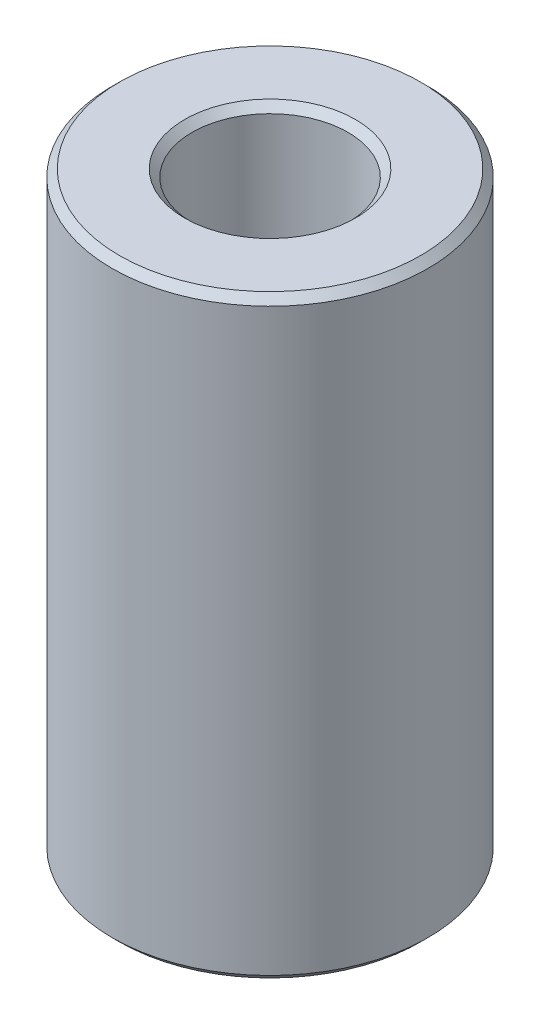
ISO-10303-21;
HEADER;
FILE_DESCRIPTION(('STEP AP214'),'2;1');
FILE_NAME('part.step','',(''),(''),'','','');
FILE_SCHEMA(('AUTOMOTIVE_DESIGN { 1 0 10303 214 1 1 1 1 }'));
ENDSEC;
DATA;
#1=APPLICATION_CONTEXT('core data for automotive mechanical design processes');
#2=APPLICATION_PROTOCOL_DEFINITION('international standard','automotive_design',2000,#1);
#3=PRODUCT_CONTEXT('',#1,'mechanical');
#4=PRODUCT('Part','Part','',(#3));
#5=PRODUCT_RELATED_PRODUCT_CATEGORY('part','',(#4));
#6=PRODUCT_DEFINITION_FORMATION('','',#4);
#7=PRODUCT_DEFINITION_CONTEXT('part definition',#1,'design');
#8=PRODUCT_DEFINITION('design','',#6,#7);
#9=PRODUCT_DEFINITION_SHAPE('','',#8);
#10=(LENGTH_UNIT() NAMED_UNIT(*) SI_UNIT(.MILLI.,.METRE.));
#11=(NAMED_UNIT(*) PLANE_ANGLE_UNIT() SI_UNIT($,.RADIAN.));
#12=(NAMED_UNIT(*) SI_UNIT($,.STERADIAN.) SOLID_ANGLE_UNIT());
#13=UNCERTAINTY_MEASURE_WITH_UNIT(LENGTH_MEASURE(1.E-05),#10,'distance_accuracy_value','');
#14=(GEOMETRIC_REPRESENTATION_CONTEXT(3) GLOBAL_UNCERTAINTY_ASSIGNED_CONTEXT((#13)) GLOBAL_UNIT_ASSIGNED_CONTEXT((#10,
#11,#12)) REPRESENTATION_CONTEXT('',''));
#15=CARTESIAN_POINT('',(0.,0.,0.));
#16=DIRECTION('',(0.,0.,1.));
#17=DIRECTION('',(1.,0.,0.));
#18=AXIS2_PLACEMENT_3D('',#15,#16,#17);
#19=CARTESIAN_POINT('',(0.,16.,0.));
#20=DIRECTION('',(0.,1.,0.));
#21=DIRECTION('',(0.,0.,1.));
#22=AXIS2_PLACEMENT_3D('',#19,#20,#21);
#23=PLANE('',#22);
#24=CARTESIAN_POINT('',(0.,16.,0.));
#25=DIRECTION('',(0.,1.,0.));
#26=DIRECTION('',(0.,0.,1.));
#27=AXIS2_PLACEMENT_3D('',#24,#25,#26);
#28=CIRCLE('',#27,2.3);
#29=CARTESIAN_POINT('',(0.,16.,2.3));
#30=VERTEX_POINT('',#29);
#31=EDGE_CURVE('E57',#30,#30,#28,.F.);
#32=ORIENTED_EDGE('',*,*,#31,.T.);
#33=EDGE_LOOP('',(#32));
#34=FACE_BOUND('',#33,.T.);
#35=CARTESIAN_POINT('',(0.,16.,0.));
#36=DIRECTION('',(0.,1.,0.));
#37=DIRECTION('',(0.,0.,1.));
#38=AXIS2_PLACEMENT_3D('',#35,#36,#37);
#39=CIRCLE('',#38,4.05);
#40=CARTESIAN_POINT('',(0.,16.,4.05));
#41=VERTEX_POINT('',#40);
#42=EDGE_CURVE('E60',#41,#41,#39,.T.);
#43=ORIENTED_EDGE('',*,*,#42,.T.);
#44=EDGE_LOOP('',(#43));
#45=FACE_BOUND('',#44,.T.);
#46=ADVANCED_FACE('F36',(#34,#45),#23,.T.);
#47=CARTESIAN_POINT('',(0.,0.,0.));
#48=DIRECTION('',(0.,1.,0.));
#49=DIRECTION('',(0.,0.,1.));
#50=AXIS2_PLACEMENT_3D('',#47,#48,#49);
#51=PLANE('',#50);
#52=CARTESIAN_POINT('',(0.,0.,0.));
#53=DIRECTION('',(0.,1.,0.));
#54=DIRECTION('',(0.,0.,1.));
#55=AXIS2_PLACEMENT_3D('',#52,#53,#54);
#56=CIRCLE('',#55,2.3);
#57=CARTESIAN_POINT('',(0.,0.,2.3));
#58=VERTEX_POINT('',#57);
#59=EDGE_CURVE('E10',#58,#58,#56,.T.);
#60=ORIENTED_EDGE('',*,*,#59,.T.);
#61=EDGE_LOOP('',(#60));
#62=FACE_BOUND('',#61,.T.);
#63=CARTESIAN_POINT('',(0.,0.,0.));
#64=DIRECTION('',(0.,1.,0.));
#65=DIRECTION('',(0.,0.,1.));
#66=AXIS2_PLACEMENT_3D('',#63,#64,#65);
#67=CIRCLE('',#66,4.05);
#68=CARTESIAN_POINT('',(0.,0.,4.05));
#69=VERTEX_POINT('',#68);
#70=EDGE_CURVE('E44',#69,#69,#67,.F.);
#71=ORIENTED_EDGE('',*,*,#70,.T.);
#72=EDGE_LOOP('',(#71));
#73=FACE_BOUND('',#72,.T.);
#74=ADVANCED_FACE('F86',(#62,#73),#51,.F.);
#75=CARTESIAN_POINT('',(0.,16.,0.));
#76=DIRECTION('',(0.,-1.,0.));
#77=DIRECTION('',(0.,0.,-1.));
#78=AXIS2_PLACEMENT_3D('',#75,#76,#77);
#79=CYLINDRICAL_SURFACE('',#78,4.25);
#80=CARTESIAN_POINT('',(0.,15.8,0.));
#81=DIRECTION('',(0.,1.,0.));
#82=DIRECTION('',(0.,0.,1.));
#83=AXIS2_PLACEMENT_3D('',#80,#81,#82);
#84=CIRCLE('',#83,4.25);
#85=CARTESIAN_POINT('',(0.,15.8,4.25));
#86=VERTEX_POINT('',#85);
#87=EDGE_CURVE('E48',#86,#86,#84,.F.);
#88=ORIENTED_EDGE('',*,*,#87,.T.);
#89=EDGE_LOOP('',(#88));
#90=FACE_BOUND('',#89,.T.);
#91=CARTESIAN_POINT('',(0.,0.200000000000002,0.));
#92=DIRECTION('',(0.,1.,0.));
#93=DIRECTION('',(0.,0.,1.));
#94=AXIS2_PLACEMENT_3D('',#91,#92,#93);
#95=CIRCLE('',#94,4.25);
#96=CARTESIAN_POINT('',(0.,0.200000000000002,4.25));
#97=VERTEX_POINT('',#96);
#98=EDGE_CURVE('E52',#97,#97,#95,.T.);
#99=ORIENTED_EDGE('',*,*,#98,.T.);
#100=EDGE_LOOP('',(#99));
#101=FACE_BOUND('',#100,.T.);
#102=ADVANCED_FACE('F92',(#90,#101),#79,.T.);
#103=CARTESIAN_POINT('',(0.,16.,0.));
#104=DIRECTION('',(0.,-1.,0.));
#105=DIRECTION('',(0.,0.,-1.));
#106=AXIS2_PLACEMENT_3D('',#103,#104,#105);
#107=CYLINDRICAL_SURFACE('',#106,2.1);
#108=CARTESIAN_POINT('',(0.,15.8,0.));
#109=DIRECTION('',(0.,1.,0.));
#110=DIRECTION('',(0.,0.,1.));
#111=AXIS2_PLACEMENT_3D('',#108,#109,#110);
#112=CIRCLE('',#111,2.1);
#113=CARTESIAN_POINT('',(0.,15.8,2.1));
#114=VERTEX_POINT('',#113);
#115=EDGE_CURVE('E63',#114,#114,#112,.T.);
#116=ORIENTED_EDGE('',*,*,#115,.T.);
#117=EDGE_LOOP('',(#116));
#118=FACE_BOUND('',#117,.T.);
#119=CARTESIAN_POINT('',(0.,0.199999999999999,0.));
#120=DIRECTION('',(0.,1.,0.));
#121=DIRECTION('',(0.,0.,1.));
#122=AXIS2_PLACEMENT_3D('',#119,#120,#121);
#123=CIRCLE('',#122,2.1);
#124=CARTESIAN_POINT('',(0.,0.199999999999999,2.1));
#125=VERTEX_POINT('',#124);
#126=EDGE_CURVE('E66',#125,#125,#123,.F.);
#127=ORIENTED_EDGE('',*,*,#126,.T.);
#128=EDGE_LOOP('',(#127));
#129=FACE_BOUND('',#128,.T.);
#130=ADVANCED_FACE('F70',(#118,#129),#107,.F.);
#131=CARTESIAN_POINT('',(0.,15.8,0.));
#132=DIRECTION('',(0.,1.,0.));
#133=DIRECTION('',(0.,0.,1.));
#134=AXIS2_PLACEMENT_3D('',#131,#132,#133);
#135=CONICAL_SURFACE('',#134,2.1,0.785398163397446);
#136=ORIENTED_EDGE('',*,*,#31,.F.);
#137=EDGE_LOOP('',(#136));
#138=FACE_BOUND('',#137,.T.);
#139=ORIENTED_EDGE('',*,*,#115,.F.);
#140=EDGE_LOOP('',(#139));
#141=FACE_BOUND('',#140,.T.);
#142=ADVANCED_FACE('F81',(#138,#141),#135,.F.);
#143=CARTESIAN_POINT('',(0.,16.,0.));
#144=DIRECTION('',(0.,-1.,0.));
#145=DIRECTION('',(0.,0.,-1.));
#146=AXIS2_PLACEMENT_3D('',#143,#144,#145);
#147=CONICAL_SURFACE('',#146,4.05,0.785398163397448);
#148=ORIENTED_EDGE('',*,*,#87,.F.);
#149=EDGE_LOOP('',(#148));
#150=FACE_BOUND('',#149,.T.);
#151=ORIENTED_EDGE('',*,*,#42,.F.);
#152=EDGE_LOOP('',(#151));
#153=FACE_BOUND('',#152,.T.);
#154=ADVANCED_FACE('F75',(#150,#153),#147,.T.);
#155=CARTESIAN_POINT('',(0.,0.,0.));
#156=DIRECTION('',(0.,-1.,0.));
#157=DIRECTION('',(0.,0.,-1.));
#158=AXIS2_PLACEMENT_3D('',#155,#156,#157);
#159=CONICAL_SURFACE('',#158,2.3,0.785398163397446);
#160=ORIENTED_EDGE('',*,*,#126,.F.);
#161=EDGE_LOOP('',(#160));
#162=FACE_BOUND('',#161,.T.);
#163=ORIENTED_EDGE('',*,*,#59,.F.);
#164=EDGE_LOOP('',(#163));
#165=FACE_BOUND('',#164,.T.);
#166=ADVANCED_FACE('F72',(#162,#165),#159,.F.);
#167=CARTESIAN_POINT('',(0.,0.200000000000002,0.));
#168=DIRECTION('',(0.,1.,0.));
#169=DIRECTION('',(0.,0.,1.));
#170=AXIS2_PLACEMENT_3D('',#167,#168,#169);
#171=CONICAL_SURFACE('',#170,4.25,0.785398163397448);
#172=ORIENTED_EDGE('',*,*,#70,.F.);
#173=EDGE_LOOP('',(#172));
#174=FACE_BOUND('',#173,.T.);
#175=ORIENTED_EDGE('',*,*,#98,.F.);
#176=EDGE_LOOP('',(#175));
#177=FACE_BOUND('',#176,.T.);
#178=ADVANCED_FACE('F39',(#174,#177),#171,.T.);
#179=CLOSED_SHELL('',(#46,#74,#102,#130,#142,#154,#166,#178));
#180=MANIFOLD_SOLID_BREP('B2',#179);
#181=ADVANCED_BREP_SHAPE_REPRESENTATION('',(#18,#180),#14);
#182=SHAPE_DEFINITION_REPRESENTATION(#9,#181);
ENDSEC;
END-ISO-10303-21;
